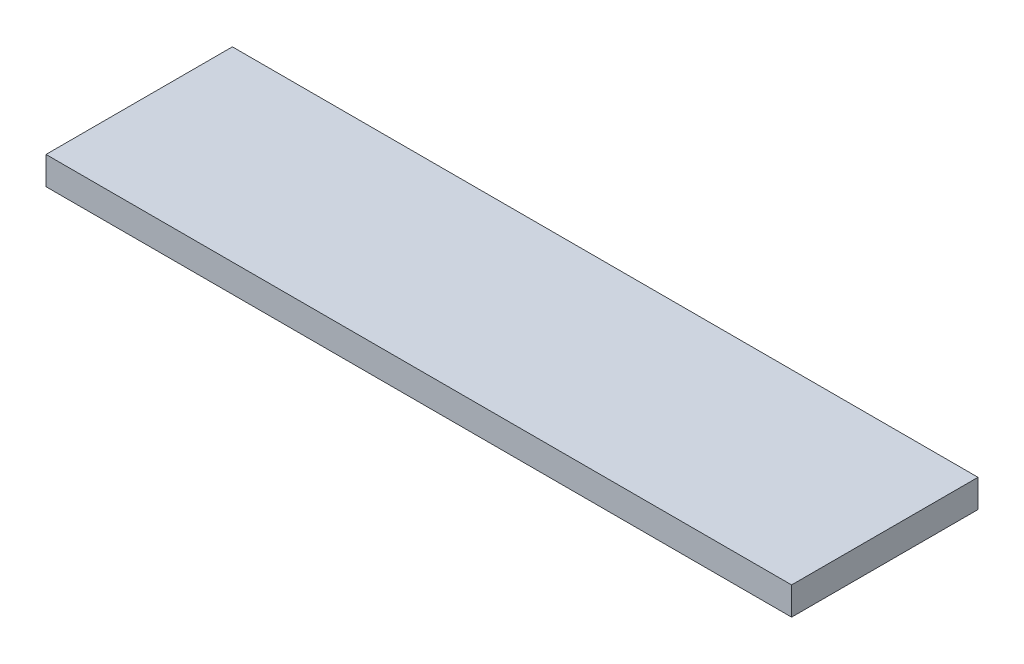
ISO-10303-21;
HEADER;
FILE_DESCRIPTION(('STEP AP214'),'2;1');
FILE_NAME('part.step','',(''),(''),'','','');
FILE_SCHEMA(('AUTOMOTIVE_DESIGN { 1 0 10303 214 1 1 1 1 }'));
ENDSEC;
DATA;
#1=APPLICATION_CONTEXT('core data for automotive mechanical design processes');
#2=APPLICATION_PROTOCOL_DEFINITION('international standard','automotive_design',2000,#1);
#3=PRODUCT_CONTEXT('',#1,'mechanical');
#4=PRODUCT('Part','Part','',(#3));
#5=PRODUCT_RELATED_PRODUCT_CATEGORY('part','',(#4));
#6=PRODUCT_DEFINITION_FORMATION('','',#4);
#7=PRODUCT_DEFINITION_CONTEXT('part definition',#1,'design');
#8=PRODUCT_DEFINITION('design','',#6,#7);
#9=PRODUCT_DEFINITION_SHAPE('','',#8);
#10=(LENGTH_UNIT() NAMED_UNIT(*) SI_UNIT(.MILLI.,.METRE.));
#11=(NAMED_UNIT(*) PLANE_ANGLE_UNIT() SI_UNIT($,.RADIAN.));
#12=(NAMED_UNIT(*) SI_UNIT($,.STERADIAN.) SOLID_ANGLE_UNIT());
#13=UNCERTAINTY_MEASURE_WITH_UNIT(LENGTH_MEASURE(1.E-05),#10,'distance_accuracy_value','');
#14=(GEOMETRIC_REPRESENTATION_CONTEXT(3) GLOBAL_UNCERTAINTY_ASSIGNED_CONTEXT((#13)) GLOBAL_UNIT_ASSIGNED_CONTEXT((#10,
#11,#12)) REPRESENTATION_CONTEXT('',''));
#15=CARTESIAN_POINT('',(0.,0.,0.));
#16=DIRECTION('',(0.,0.,1.));
#17=DIRECTION('',(1.,0.,0.));
#18=AXIS2_PLACEMENT_3D('',#15,#16,#17);
#19=CARTESIAN_POINT('',(-31.75,2.38125,-7.9375));
#20=DIRECTION('',(1.,0.,0.));
#21=DIRECTION('',(0.,0.,-1.));
#22=AXIS2_PLACEMENT_3D('',#19,#20,#21);
#23=PLANE('',#22);
#24=DIRECTION('',(0.,0.,1.));
#25=VECTOR('',#24,1.);
#26=CARTESIAN_POINT('',(-31.75,0.,-7.9375));
#27=LINE('',#26,#25);
#28=CARTESIAN_POINT('',(-31.75,0.,-7.9375));
#29=VERTEX_POINT('',#28);
#30=CARTESIAN_POINT('',(-31.75,0.,7.9375));
#31=VERTEX_POINT('',#30);
#32=EDGE_CURVE('E108',#29,#31,#27,.T.);
#33=ORIENTED_EDGE('',*,*,#32,.T.);
#34=DIRECTION('',(0.,-1.,0.));
#35=VECTOR('',#34,1.);
#36=CARTESIAN_POINT('',(-31.75,2.38125,7.9375));
#37=LINE('',#36,#35);
#38=CARTESIAN_POINT('',(-31.75,2.38125,7.9375));
#39=VERTEX_POINT('',#38);
#40=EDGE_CURVE('E11',#39,#31,#37,.T.);
#41=ORIENTED_EDGE('',*,*,#40,.F.);
#42=DIRECTION('',(0.,0.,1.));
#43=VECTOR('',#42,1.);
#44=CARTESIAN_POINT('',(-31.75,2.38125,-7.9375));
#45=LINE('',#44,#43);
#46=CARTESIAN_POINT('',(-31.75,2.38125,-7.9375));
#47=VERTEX_POINT('',#46);
#48=EDGE_CURVE('E92',#47,#39,#45,.T.);
#49=ORIENTED_EDGE('',*,*,#48,.F.);
#50=DIRECTION('',(0.,-1.,0.));
#51=VECTOR('',#50,1.);
#52=CARTESIAN_POINT('',(-31.75,2.38125,-7.9375));
#53=LINE('',#52,#51);
#54=EDGE_CURVE('E104',#47,#29,#53,.T.);
#55=ORIENTED_EDGE('',*,*,#54,.T.);
#56=EDGE_LOOP('',(#33,#41,#49,#55));
#57=FACE_BOUND('',#56,.T.);
#58=ADVANCED_FACE('F40',(#57),#23,.F.);
#59=CARTESIAN_POINT('',(-31.75,2.38125,7.9375));
#60=DIRECTION('',(0.,0.,-1.));
#61=DIRECTION('',(-1.,0.,0.));
#62=AXIS2_PLACEMENT_3D('',#59,#60,#61);
#63=PLANE('',#62);
#64=DIRECTION('',(1.,0.,0.));
#65=VECTOR('',#64,1.);
#66=CARTESIAN_POINT('',(-31.75,0.,7.9375));
#67=LINE('',#66,#65);
#68=CARTESIAN_POINT('',(31.75,0.,7.9375));
#69=VERTEX_POINT('',#68);
#70=EDGE_CURVE('E97',#31,#69,#67,.T.);
#71=ORIENTED_EDGE('',*,*,#70,.T.);
#72=DIRECTION('',(0.,-1.,0.));
#73=VECTOR('',#72,1.);
#74=CARTESIAN_POINT('',(31.75,2.38125,7.9375));
#75=LINE('',#74,#73);
#76=CARTESIAN_POINT('',(31.75,2.38125,7.9375));
#77=VERTEX_POINT('',#76);
#78=EDGE_CURVE('E49',#77,#69,#75,.T.);
#79=ORIENTED_EDGE('',*,*,#78,.F.);
#80=DIRECTION('',(1.,0.,0.));
#81=VECTOR('',#80,1.);
#82=CARTESIAN_POINT('',(-31.75,2.38125,7.9375));
#83=LINE('',#82,#81);
#84=EDGE_CURVE('E87',#39,#77,#83,.T.);
#85=ORIENTED_EDGE('',*,*,#84,.F.);
#86=ORIENTED_EDGE('',*,*,#40,.T.);
#87=EDGE_LOOP('',(#71,#79,#85,#86));
#88=FACE_BOUND('',#87,.T.);
#89=ADVANCED_FACE('F96',(#88),#63,.F.);
#90=CARTESIAN_POINT('',(31.75,2.38125,-7.9375));
#91=DIRECTION('',(-1.,0.,0.));
#92=DIRECTION('',(0.,0.,1.));
#93=AXIS2_PLACEMENT_3D('',#90,#91,#92);
#94=PLANE('',#93);
#95=DIRECTION('',(0.,0.,-1.));
#96=VECTOR('',#95,1.);
#97=CARTESIAN_POINT('',(31.75,0.,-7.9375));
#98=LINE('',#97,#96);
#99=CARTESIAN_POINT('',(31.75,0.,-7.9375));
#100=VERTEX_POINT('',#99);
#101=EDGE_CURVE('E74',#69,#100,#98,.T.);
#102=ORIENTED_EDGE('',*,*,#101,.T.);
#103=DIRECTION('',(0.,-1.,0.));
#104=VECTOR('',#103,1.);
#105=CARTESIAN_POINT('',(31.75,2.38125,-7.9375));
#106=LINE('',#105,#104);
#107=CARTESIAN_POINT('',(31.75,2.38125,-7.9375));
#108=VERTEX_POINT('',#107);
#109=EDGE_CURVE('E99',#108,#100,#106,.T.);
#110=ORIENTED_EDGE('',*,*,#109,.F.);
#111=DIRECTION('',(0.,0.,-1.));
#112=VECTOR('',#111,1.);
#113=CARTESIAN_POINT('',(31.75,2.38125,-7.9375));
#114=LINE('',#113,#112);
#115=EDGE_CURVE('E90',#77,#108,#114,.T.);
#116=ORIENTED_EDGE('',*,*,#115,.F.);
#117=ORIENTED_EDGE('',*,*,#78,.T.);
#118=EDGE_LOOP('',(#102,#110,#116,#117));
#119=FACE_BOUND('',#118,.T.);
#120=ADVANCED_FACE('F100',(#119),#94,.F.);
#121=CARTESIAN_POINT('',(-31.75,2.38125,-7.9375));
#122=DIRECTION('',(0.,0.,1.));
#123=DIRECTION('',(1.,0.,0.));
#124=AXIS2_PLACEMENT_3D('',#121,#122,#123);
#125=PLANE('',#124);
#126=DIRECTION('',(-1.,0.,0.));
#127=VECTOR('',#126,1.);
#128=CARTESIAN_POINT('',(-31.75,0.,-7.9375));
#129=LINE('',#128,#127);
#130=EDGE_CURVE('E80',#100,#29,#129,.T.);
#131=ORIENTED_EDGE('',*,*,#130,.T.);
#132=ORIENTED_EDGE('',*,*,#54,.F.);
#133=DIRECTION('',(-1.,0.,0.));
#134=VECTOR('',#133,1.);
#135=CARTESIAN_POINT('',(-31.75,2.38125,-7.9375));
#136=LINE('',#135,#134);
#137=EDGE_CURVE('E57',#108,#47,#136,.T.);
#138=ORIENTED_EDGE('',*,*,#137,.F.);
#139=ORIENTED_EDGE('',*,*,#109,.T.);
#140=EDGE_LOOP('',(#131,#132,#138,#139));
#141=FACE_BOUND('',#140,.T.);
#142=ADVANCED_FACE('F122',(#141),#125,.F.);
#143=CARTESIAN_POINT('',(0.,2.38125,0.));
#144=DIRECTION('',(0.,1.,0.));
#145=DIRECTION('',(0.,0.,1.));
#146=AXIS2_PLACEMENT_3D('',#143,#144,#145);
#147=PLANE('',#146);
#148=CARTESIAN_POINT('',(0.,2.38125,0.));
#149=DIRECTION('',(0.,1.,0.));
#150=DIRECTION('',(0.,0.,1.));
#151=AXIS2_PLACEMENT_3D('',#148,#149,#150);
#152=CIRCLE('',#151,0.0127);
#153=CARTESIAN_POINT('',(0.,2.38125,0.0127));
#154=VERTEX_POINT('',#153);
#155=EDGE_CURVE('E132',#154,#154,#152,.T.);
#156=ORIENTED_EDGE('',*,*,#155,.F.);
#157=EDGE_LOOP('',(#156));
#158=FACE_BOUND('',#157,.T.);
#159=ORIENTED_EDGE('',*,*,#48,.T.);
#160=ORIENTED_EDGE('',*,*,#84,.T.);
#161=ORIENTED_EDGE('',*,*,#115,.T.);
#162=ORIENTED_EDGE('',*,*,#137,.T.);
#163=EDGE_LOOP('',(#159,#160,#161,#162));
#164=FACE_BOUND('',#163,.T.);
#165=ADVANCED_FACE('F88',(#158,#164),#147,.T.);
#166=CARTESIAN_POINT('',(0.,0.,0.));
#167=DIRECTION('',(0.,1.,0.));
#168=DIRECTION('',(0.,0.,1.));
#169=AXIS2_PLACEMENT_3D('',#166,#167,#168);
#170=PLANE('',#169);
#171=CARTESIAN_POINT('',(0.,0.,0.));
#172=DIRECTION('',(0.,1.,0.));
#173=DIRECTION('',(0.,0.,1.));
#174=AXIS2_PLACEMENT_3D('',#171,#172,#173);
#175=CIRCLE('',#174,0.0127);
#176=CARTESIAN_POINT('',(0.,0.,0.0127));
#177=VERTEX_POINT('',#176);
#178=EDGE_CURVE('E112',#177,#177,#175,.F.);
#179=ORIENTED_EDGE('',*,*,#178,.F.);
#180=EDGE_LOOP('',(#179));
#181=FACE_BOUND('',#180,.T.);
#182=ORIENTED_EDGE('',*,*,#32,.F.);
#183=ORIENTED_EDGE('',*,*,#130,.F.);
#184=ORIENTED_EDGE('',*,*,#101,.F.);
#185=ORIENTED_EDGE('',*,*,#70,.F.);
#186=EDGE_LOOP('',(#182,#183,#184,#185));
#187=FACE_BOUND('',#186,.T.);
#188=ADVANCED_FACE('F125',(#181,#187),#170,.F.);
#189=CARTESIAN_POINT('',(0.,-0.00100000000000013,0.));
#190=DIRECTION('',(0.,1.,0.));
#191=DIRECTION('',(0.,0.,1.));
#192=AXIS2_PLACEMENT_3D('',#189,#190,#191);
#193=CYLINDRICAL_SURFACE('',#192,0.0127);
#194=ORIENTED_EDGE('',*,*,#155,.T.);
#195=EDGE_LOOP('',(#194));
#196=FACE_BOUND('',#195,.T.);
#197=ORIENTED_EDGE('',*,*,#178,.T.);
#198=EDGE_LOOP('',(#197));
#199=FACE_BOUND('',#198,.T.);
#200=ADVANCED_FACE('F137',(#196,#199),#193,.F.);
#201=CLOSED_SHELL('',(#58,#89,#120,#142,#165,#188,#200));
#202=MANIFOLD_SOLID_BREP('B2',#201);
#203=ADVANCED_BREP_SHAPE_REPRESENTATION('',(#18,#202),#14);
#204=SHAPE_DEFINITION_REPRESENTATION(#9,#203);
ENDSEC;
END-ISO-10303-21;
